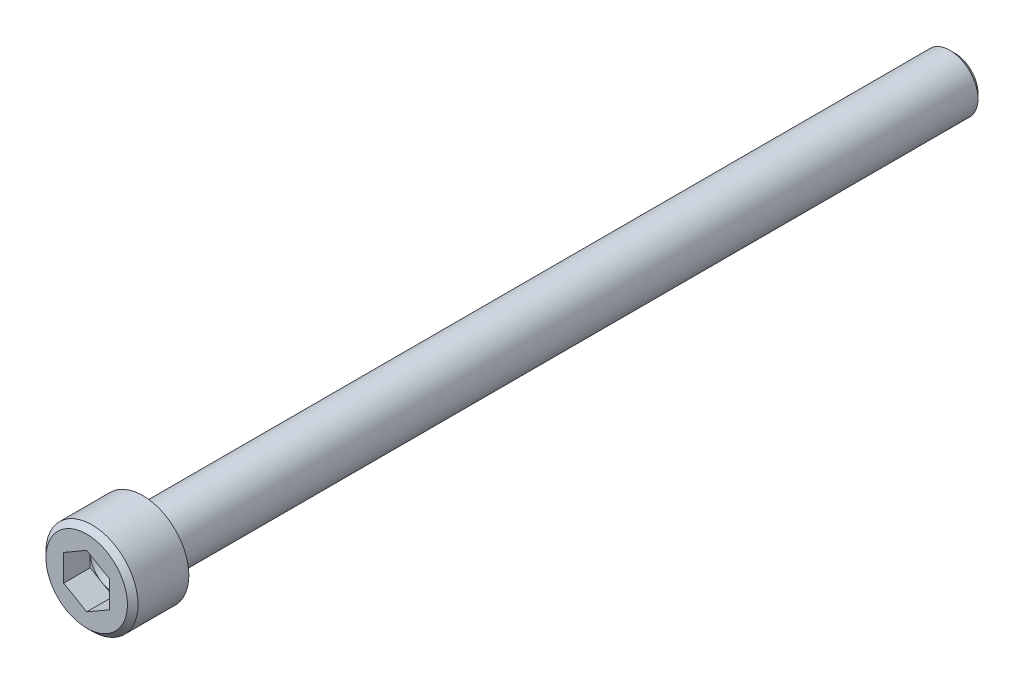
ISO-10303-21;
HEADER;
FILE_DESCRIPTION(('STEP AP214'),'2;1');
FILE_NAME('part.step','',(''),(''),'','','');
FILE_SCHEMA(('AUTOMOTIVE_DESIGN { 1 0 10303 214 1 1 1 1 }'));
ENDSEC;
DATA;
#1=APPLICATION_CONTEXT('core data for automotive mechanical design processes');
#2=APPLICATION_PROTOCOL_DEFINITION('international standard','automotive_design',2000,#1);
#3=PRODUCT_CONTEXT('',#1,'mechanical');
#4=PRODUCT('Part','Part','',(#3));
#5=PRODUCT_RELATED_PRODUCT_CATEGORY('part','',(#4));
#6=PRODUCT_DEFINITION_FORMATION('','',#4);
#7=PRODUCT_DEFINITION_CONTEXT('part definition',#1,'design');
#8=PRODUCT_DEFINITION('design','',#6,#7);
#9=PRODUCT_DEFINITION_SHAPE('','',#8);
#10=(LENGTH_UNIT() NAMED_UNIT(*) SI_UNIT(.MILLI.,.METRE.));
#11=(NAMED_UNIT(*) PLANE_ANGLE_UNIT() SI_UNIT($,.RADIAN.));
#12=(NAMED_UNIT(*) SI_UNIT($,.STERADIAN.) SOLID_ANGLE_UNIT());
#13=UNCERTAINTY_MEASURE_WITH_UNIT(LENGTH_MEASURE(1.E-05),#10,'distance_accuracy_value','');
#14=(GEOMETRIC_REPRESENTATION_CONTEXT(3) GLOBAL_UNCERTAINTY_ASSIGNED_CONTEXT((#13)) GLOBAL_UNIT_ASSIGNED_CONTEXT((#10,
#11,#12)) REPRESENTATION_CONTEXT('',''));
#15=CARTESIAN_POINT('',(0.,0.,0.));
#16=DIRECTION('',(0.,0.,1.));
#17=DIRECTION('',(1.,0.,0.));
#18=AXIS2_PLACEMENT_3D('',#15,#16,#17);
#19=CARTESIAN_POINT('',(0.,0.,2.54));
#20=DIRECTION('',(0.,0.,1.));
#21=DIRECTION('',(1.,0.,0.));
#22=AXIS2_PLACEMENT_3D('',#19,#20,#21);
#23=PLANE('',#22);
#24=DIRECTION('',(0.,1.,0.));
#25=VECTOR('',#24,1.);
#26=CARTESIAN_POINT('',(-1.9812,0.,2.54));
#27=LINE('',#26,#25);
#28=CARTESIAN_POINT('',(-1.9812,0.,2.54));
#29=VERTEX_POINT('',#28);
#30=CARTESIAN_POINT('',(-1.9812,1.14384635331848,2.54));
#31=VERTEX_POINT('',#30);
#32=EDGE_CURVE('E398',#29,#31,#27,.T.);
#33=ORIENTED_EDGE('',*,*,#32,.F.);
#34=CARTESIAN_POINT('',(0.,0.,2.54));
#35=DIRECTION('',(0.,0.,-1.));
#36=DIRECTION('',(-1.,0.,0.));
#37=AXIS2_PLACEMENT_3D('',#34,#35,#36);
#38=CIRCLE('',#37,1.9812);
#39=CARTESIAN_POINT('',(-0.9906,1.71576952997773,2.54));
#40=VERTEX_POINT('',#39);
#41=EDGE_CURVE('E33',#29,#40,#38,.T.);
#42=ORIENTED_EDGE('',*,*,#41,.T.);
#43=DIRECTION('',(0.866025403784439,0.5,0.));
#44=VECTOR('',#43,1.);
#45=CARTESIAN_POINT('',(0.163354175866616,2.38200528404682,2.54));
#46=LINE('',#45,#44);
#47=EDGE_CURVE('E393',#31,#40,#46,.T.);
#48=ORIENTED_EDGE('',*,*,#47,.F.);
#49=EDGE_LOOP('',(#33,#42,#48));
#50=FACE_BOUND('',#49,.T.);
#51=ADVANCED_FACE('F17',(#50),#23,.T.);
#52=CARTESIAN_POINT('',(0.,2.28769270663697,2.54));
#53=VERTEX_POINT('',#52);
#54=EDGE_CURVE('E391',#40,#53,#46,.T.);
#55=ORIENTED_EDGE('',*,*,#54,.F.);
#56=CARTESIAN_POINT('',(0.9906,1.71576952997773,2.54));
#57=VERTEX_POINT('',#56);
#58=EDGE_CURVE('E224',#40,#57,#38,.T.);
#59=ORIENTED_EDGE('',*,*,#58,.T.);
#60=DIRECTION('',(0.866025403784439,-0.5,0.));
#61=VECTOR('',#60,1.);
#62=CARTESIAN_POINT('',(-0.163354175866613,2.38200528404681,2.54));
#63=LINE('',#62,#61);
#64=EDGE_CURVE('E383',#53,#57,#63,.T.);
#65=ORIENTED_EDGE('',*,*,#64,.F.);
#66=EDGE_LOOP('',(#55,#59,#65));
#67=FACE_BOUND('',#66,.T.);
#68=ADVANCED_FACE('F105',(#67),#23,.T.);
#69=CARTESIAN_POINT('',(1.9812,1.14384635331849,2.54));
#70=VERTEX_POINT('',#69);
#71=EDGE_CURVE('E189',#57,#70,#63,.T.);
#72=ORIENTED_EDGE('',*,*,#71,.F.);
#73=CARTESIAN_POINT('',(1.9812,0.,2.54));
#74=VERTEX_POINT('',#73);
#75=EDGE_CURVE('E380',#57,#74,#38,.T.);
#76=ORIENTED_EDGE('',*,*,#75,.T.);
#77=DIRECTION('',(0.,-1.,0.));
#78=VECTOR('',#77,1.);
#79=CARTESIAN_POINT('',(1.9812,0.,2.54));
#80=LINE('',#79,#78);
#81=EDGE_CURVE('E160',#70,#74,#80,.T.);
#82=ORIENTED_EDGE('',*,*,#81,.F.);
#83=EDGE_LOOP('',(#72,#76,#82));
#84=FACE_BOUND('',#83,.T.);
#85=ADVANCED_FACE('F111',(#84),#23,.T.);
#86=CARTESIAN_POINT('',(1.9812,-1.14384635331849,2.54));
#87=VERTEX_POINT('',#86);
#88=EDGE_CURVE('E155',#74,#87,#80,.T.);
#89=ORIENTED_EDGE('',*,*,#88,.F.);
#90=CARTESIAN_POINT('',(0.9906,-1.71576952997773,2.54));
#91=VERTEX_POINT('',#90);
#92=EDGE_CURVE('E416',#74,#91,#38,.T.);
#93=ORIENTED_EDGE('',*,*,#92,.T.);
#94=DIRECTION('',(-0.866025403784438,-0.5,0.));
#95=VECTOR('',#94,1.);
#96=CARTESIAN_POINT('',(2.14455417586661,-1.04953377590865,2.54));
#97=LINE('',#96,#95);
#98=EDGE_CURVE('E148',#87,#91,#97,.T.);
#99=ORIENTED_EDGE('',*,*,#98,.F.);
#100=EDGE_LOOP('',(#89,#93,#99));
#101=FACE_BOUND('',#100,.T.);
#102=ADVANCED_FACE('F129',(#101),#23,.T.);
#103=CARTESIAN_POINT('',(0.,-2.28769270663697,2.54));
#104=VERTEX_POINT('',#103);
#105=EDGE_CURVE('E141',#91,#104,#97,.T.);
#106=ORIENTED_EDGE('',*,*,#105,.F.);
#107=CARTESIAN_POINT('',(-0.9906,-1.71576952997773,2.54));
#108=VERTEX_POINT('',#107);
#109=EDGE_CURVE('E143',#91,#108,#38,.T.);
#110=ORIENTED_EDGE('',*,*,#109,.T.);
#111=DIRECTION('',(-0.866025403784439,0.5,0.));
#112=VECTOR('',#111,1.);
#113=CARTESIAN_POINT('',(-2.14455417586661,-1.04953377590865,2.54));
#114=LINE('',#113,#112);
#115=EDGE_CURVE('E145',#104,#108,#114,.T.);
#116=ORIENTED_EDGE('',*,*,#115,.F.);
#117=EDGE_LOOP('',(#106,#110,#116));
#118=FACE_BOUND('',#117,.T.);
#119=ADVANCED_FACE('F119',(#118),#23,.T.);
#120=CARTESIAN_POINT('',(0.,0.,4.826));
#121=DIRECTION('',(0.,0.,1.));
#122=DIRECTION('',(1.,0.,0.));
#123=AXIS2_PLACEMENT_3D('',#120,#121,#122);
#124=PLANE('',#123);
#125=CARTESIAN_POINT('',(0.,0.,4.826));
#126=DIRECTION('',(0.,0.,1.));
#127=DIRECTION('',(1.,0.,0.));
#128=AXIS2_PLACEMENT_3D('',#125,#126,#127);
#129=CIRCLE('',#128,3.5052);
#130=CARTESIAN_POINT('',(3.5052,0.,4.826));
#131=VERTEX_POINT('',#130);
#132=EDGE_CURVE('E210',#131,#131,#129,.T.);
#133=ORIENTED_EDGE('',*,*,#132,.T.);
#134=EDGE_LOOP('',(#133));
#135=FACE_BOUND('',#134,.T.);
#136=DIRECTION('',(0.866025403784439,0.5,0.));
#137=VECTOR('',#136,1.);
#138=CARTESIAN_POINT('',(0.163354175866616,2.38200528404682,4.826));
#139=LINE('',#138,#137);
#140=CARTESIAN_POINT('',(-1.9812,1.14384635331848,4.826));
#141=VERTEX_POINT('',#140);
#142=CARTESIAN_POINT('',(0.,2.28769270663697,4.826));
#143=VERTEX_POINT('',#142);
#144=EDGE_CURVE('E171',#141,#143,#139,.T.);
#145=ORIENTED_EDGE('',*,*,#144,.T.);
#146=DIRECTION('',(0.866025403784439,-0.5,0.));
#147=VECTOR('',#146,1.);
#148=CARTESIAN_POINT('',(-0.163354175866613,2.38200528404681,4.826));
#149=LINE('',#148,#147);
#150=CARTESIAN_POINT('',(1.9812,1.14384635331849,4.826));
#151=VERTEX_POINT('',#150);
#152=EDGE_CURVE('E167',#143,#151,#149,.T.);
#153=ORIENTED_EDGE('',*,*,#152,.T.);
#154=DIRECTION('',(0.,-1.,0.));
#155=VECTOR('',#154,1.);
#156=CARTESIAN_POINT('',(1.9812,0.,4.826));
#157=LINE('',#156,#155);
#158=CARTESIAN_POINT('',(1.9812,-1.14384635331849,4.826));
#159=VERTEX_POINT('',#158);
#160=EDGE_CURVE('E185',#151,#159,#157,.T.);
#161=ORIENTED_EDGE('',*,*,#160,.T.);
#162=DIRECTION('',(-0.866025403784438,-0.5,0.));
#163=VECTOR('',#162,1.);
#164=CARTESIAN_POINT('',(2.14455417586661,-1.04953377590865,4.826));
#165=LINE('',#164,#163);
#166=CARTESIAN_POINT('',(0.,-2.28769270663697,4.826));
#167=VERTEX_POINT('',#166);
#168=EDGE_CURVE('E41',#159,#167,#165,.T.);
#169=ORIENTED_EDGE('',*,*,#168,.T.);
#170=DIRECTION('',(-0.866025403784439,0.5,0.));
#171=VECTOR('',#170,1.);
#172=CARTESIAN_POINT('',(-2.14455417586661,-1.04953377590865,4.826));
#173=LINE('',#172,#171);
#174=CARTESIAN_POINT('',(-1.9812,-1.14384635331849,4.826));
#175=VERTEX_POINT('',#174);
#176=EDGE_CURVE('E179',#167,#175,#173,.T.);
#177=ORIENTED_EDGE('',*,*,#176,.T.);
#178=DIRECTION('',(0.,1.,0.));
#179=VECTOR('',#178,1.);
#180=CARTESIAN_POINT('',(-1.9812,0.,4.826));
#181=LINE('',#180,#179);
#182=EDGE_CURVE('E175',#175,#141,#181,.T.);
#183=ORIENTED_EDGE('',*,*,#182,.T.);
#184=EDGE_LOOP('',(#145,#153,#161,#169,#177,#183));
#185=FACE_BOUND('',#184,.T.);
#186=ADVANCED_FACE('F128',(#135,#185),#124,.T.);
#187=CARTESIAN_POINT('',(0.,0.,4.826));
#188=DIRECTION('',(0.,0.,-1.));
#189=DIRECTION('',(-1.,0.,0.));
#190=AXIS2_PLACEMENT_3D('',#187,#188,#189);
#191=CYLINDRICAL_SURFACE('',#190,3.9624);
#192=CARTESIAN_POINT('',(0.,0.,4.3688));
#193=DIRECTION('',(0.,0.,1.));
#194=DIRECTION('',(1.,0.,0.));
#195=AXIS2_PLACEMENT_3D('',#192,#193,#194);
#196=CIRCLE('',#195,3.9624);
#197=CARTESIAN_POINT('',(3.9624,0.,4.3688));
#198=VERTEX_POINT('',#197);
#199=EDGE_CURVE('E214',#198,#198,#196,.F.);
#200=ORIENTED_EDGE('',*,*,#199,.T.);
#201=EDGE_LOOP('',(#200));
#202=FACE_BOUND('',#201,.T.);
#203=CARTESIAN_POINT('',(0.,0.,0.));
#204=DIRECTION('',(0.,0.,1.));
#205=DIRECTION('',(1.,0.,0.));
#206=AXIS2_PLACEMENT_3D('',#203,#204,#205);
#207=CIRCLE('',#206,3.9624);
#208=CARTESIAN_POINT('',(3.9624,0.,0.));
#209=VERTEX_POINT('',#208);
#210=EDGE_CURVE('E206',#209,#209,#207,.T.);
#211=ORIENTED_EDGE('',*,*,#210,.T.);
#212=EDGE_LOOP('',(#211));
#213=FACE_BOUND('',#212,.T.);
#214=ADVANCED_FACE('F134',(#202,#213),#191,.T.);
#215=CARTESIAN_POINT('',(0.,0.,0.));
#216=DIRECTION('',(0.,0.,1.));
#217=DIRECTION('',(1.,0.,0.));
#218=AXIS2_PLACEMENT_3D('',#215,#216,#217);
#219=PLANE('',#218);
#220=CARTESIAN_POINT('',(0.,0.,0.));
#221=DIRECTION('',(0.,0.,1.));
#222=DIRECTION('',(1.,0.,0.));
#223=AXIS2_PLACEMENT_3D('',#220,#221,#222);
#224=CIRCLE('',#223,2.5654);
#225=CARTESIAN_POINT('',(2.5654,0.,0.));
#226=VERTEX_POINT('',#225);
#227=EDGE_CURVE('E223',#226,#226,#224,.T.);
#228=ORIENTED_EDGE('',*,*,#227,.T.);
#229=EDGE_LOOP('',(#228));
#230=FACE_BOUND('',#229,.T.);
#231=ORIENTED_EDGE('',*,*,#210,.F.);
#232=EDGE_LOOP('',(#231));
#233=FACE_BOUND('',#232,.T.);
#234=ADVANCED_FACE('F324',(#230,#233),#219,.F.);
#235=CARTESIAN_POINT('',(0.,0.,4.826));
#236=DIRECTION('',(0.,0.,-1.));
#237=DIRECTION('',(-1.,0.,0.));
#238=AXIS2_PLACEMENT_3D('',#235,#236,#237);
#239=CONICAL_SURFACE('',#238,3.5052,0.785398163397449);
#240=ORIENTED_EDGE('',*,*,#199,.F.);
#241=EDGE_LOOP('',(#240));
#242=FACE_BOUND('',#241,.T.);
#243=ORIENTED_EDGE('',*,*,#132,.F.);
#244=EDGE_LOOP('',(#243));
#245=FACE_BOUND('',#244,.T.);
#246=ADVANCED_FACE('F315',(#242,#245),#239,.T.);
#247=CARTESIAN_POINT('',(-0.163354175866613,2.38200528404681,2.54));
#248=DIRECTION('',(-0.5,-0.866025403784439,0.));
#249=DIRECTION('',(0.866025403784439,-0.5,0.));
#250=AXIS2_PLACEMENT_3D('',#247,#248,#249);
#251=PLANE('',#250);
#252=ORIENTED_EDGE('',*,*,#152,.F.);
#253=DIRECTION('',(0.,0.,1.));
#254=VECTOR('',#253,1.);
#255=CARTESIAN_POINT('',(0.,2.28769270663697,2.54));
#256=LINE('',#255,#254);
#257=EDGE_CURVE('E203',#53,#143,#256,.T.);
#258=ORIENTED_EDGE('',*,*,#257,.F.);
#259=ORIENTED_EDGE('',*,*,#64,.T.);
#260=ORIENTED_EDGE('',*,*,#71,.T.);
#261=DIRECTION('',(0.,0.,1.));
#262=VECTOR('',#261,1.);
#263=CARTESIAN_POINT('',(1.9812,1.14384635331849,2.54));
#264=LINE('',#263,#262);
#265=EDGE_CURVE('E166',#70,#151,#264,.T.);
#266=ORIENTED_EDGE('',*,*,#265,.T.);
#267=EDGE_LOOP('',(#252,#258,#259,#260,#266));
#268=FACE_BOUND('',#267,.T.);
#269=ADVANCED_FACE('F306',(#268),#251,.T.);
#270=CARTESIAN_POINT('',(0.163354175866616,2.38200528404682,2.54));
#271=DIRECTION('',(0.5,-0.866025403784438,0.));
#272=DIRECTION('',(0.866025403784438,0.5,0.));
#273=AXIS2_PLACEMENT_3D('',#270,#271,#272);
#274=PLANE('',#273);
#275=ORIENTED_EDGE('',*,*,#144,.F.);
#276=DIRECTION('',(0.,0.,1.));
#277=VECTOR('',#276,1.);
#278=CARTESIAN_POINT('',(-1.9812,1.14384635331848,2.54));
#279=LINE('',#278,#277);
#280=EDGE_CURVE('E200',#31,#141,#279,.T.);
#281=ORIENTED_EDGE('',*,*,#280,.F.);
#282=ORIENTED_EDGE('',*,*,#47,.T.);
#283=ORIENTED_EDGE('',*,*,#54,.T.);
#284=ORIENTED_EDGE('',*,*,#257,.T.);
#285=EDGE_LOOP('',(#275,#281,#282,#283,#284));
#286=FACE_BOUND('',#285,.T.);
#287=ADVANCED_FACE('F297',(#286),#274,.T.);
#288=CARTESIAN_POINT('',(-1.9812,0.,2.54));
#289=DIRECTION('',(1.,0.,0.));
#290=DIRECTION('',(0.,1.,0.));
#291=AXIS2_PLACEMENT_3D('',#288,#289,#290);
#292=PLANE('',#291);
#293=ORIENTED_EDGE('',*,*,#182,.F.);
#294=DIRECTION('',(0.,0.,1.));
#295=VECTOR('',#294,1.);
#296=CARTESIAN_POINT('',(-1.9812,-1.14384635331849,2.54));
#297=LINE('',#296,#295);
#298=CARTESIAN_POINT('',(-1.9812,-1.14384635331849,2.54));
#299=VERTEX_POINT('',#298);
#300=EDGE_CURVE('E197',#299,#175,#297,.T.);
#301=ORIENTED_EDGE('',*,*,#300,.F.);
#302=EDGE_CURVE('E399',#299,#29,#27,.T.);
#303=ORIENTED_EDGE('',*,*,#302,.T.);
#304=ORIENTED_EDGE('',*,*,#32,.T.);
#305=ORIENTED_EDGE('',*,*,#280,.T.);
#306=EDGE_LOOP('',(#293,#301,#303,#304,#305));
#307=FACE_BOUND('',#306,.T.);
#308=ADVANCED_FACE('F288',(#307),#292,.T.);
#309=CARTESIAN_POINT('',(-2.14455417586661,-1.04953377590865,2.54));
#310=DIRECTION('',(0.5,0.866025403784439,0.));
#311=DIRECTION('',(-0.866025403784439,0.5,0.));
#312=AXIS2_PLACEMENT_3D('',#309,#310,#311);
#313=PLANE('',#312);
#314=ORIENTED_EDGE('',*,*,#176,.F.);
#315=DIRECTION('',(0.,0.,1.));
#316=VECTOR('',#315,1.);
#317=CARTESIAN_POINT('',(0.,-2.28769270663697,2.54));
#318=LINE('',#317,#316);
#319=EDGE_CURVE('E194',#104,#167,#318,.T.);
#320=ORIENTED_EDGE('',*,*,#319,.F.);
#321=ORIENTED_EDGE('',*,*,#115,.T.);
#322=EDGE_CURVE('E402',#108,#299,#114,.T.);
#323=ORIENTED_EDGE('',*,*,#322,.T.);
#324=ORIENTED_EDGE('',*,*,#300,.T.);
#325=EDGE_LOOP('',(#314,#320,#321,#323,#324));
#326=FACE_BOUND('',#325,.T.);
#327=ADVANCED_FACE('F280',(#326),#313,.T.);
#328=CARTESIAN_POINT('',(2.14455417586661,-1.04953377590865,2.54));
#329=DIRECTION('',(-0.5,0.866025403784438,0.));
#330=DIRECTION('',(-0.866025403784438,-0.5,0.));
#331=AXIS2_PLACEMENT_3D('',#328,#329,#330);
#332=PLANE('',#331);
#333=ORIENTED_EDGE('',*,*,#168,.F.);
#334=DIRECTION('',(0.,0.,1.));
#335=VECTOR('',#334,1.);
#336=CARTESIAN_POINT('',(1.9812,-1.14384635331849,2.54));
#337=LINE('',#336,#335);
#338=EDGE_CURVE('E151',#87,#159,#337,.T.);
#339=ORIENTED_EDGE('',*,*,#338,.F.);
#340=ORIENTED_EDGE('',*,*,#98,.T.);
#341=ORIENTED_EDGE('',*,*,#105,.T.);
#342=ORIENTED_EDGE('',*,*,#319,.T.);
#343=EDGE_LOOP('',(#333,#339,#340,#341,#342));
#344=FACE_BOUND('',#343,.T.);
#345=ADVANCED_FACE('F124',(#344),#332,.T.);
#346=CARTESIAN_POINT('',(1.9812,0.,2.54));
#347=DIRECTION('',(-1.,0.,0.));
#348=DIRECTION('',(0.,-1.,0.));
#349=AXIS2_PLACEMENT_3D('',#346,#347,#348);
#350=PLANE('',#349);
#351=ORIENTED_EDGE('',*,*,#160,.F.);
#352=ORIENTED_EDGE('',*,*,#265,.F.);
#353=ORIENTED_EDGE('',*,*,#81,.T.);
#354=ORIENTED_EDGE('',*,*,#88,.T.);
#355=ORIENTED_EDGE('',*,*,#338,.T.);
#356=EDGE_LOOP('',(#351,#352,#353,#354,#355));
#357=FACE_BOUND('',#356,.T.);
#358=ADVANCED_FACE('F117',(#357),#350,.T.);
#359=ORIENTED_EDGE('',*,*,#322,.F.);
#360=EDGE_CURVE('E218',#108,#29,#38,.T.);
#361=ORIENTED_EDGE('',*,*,#360,.T.);
#362=ORIENTED_EDGE('',*,*,#302,.F.);
#363=EDGE_LOOP('',(#359,#361,#362));
#364=FACE_BOUND('',#363,.T.);
#365=ADVANCED_FACE('F108',(#364),#23,.T.);
#366=CARTESIAN_POINT('',(0.,0.,-69.85));
#367=DIRECTION('',(0.,0.,1.));
#368=DIRECTION('',(1.,0.,0.));
#369=AXIS2_PLACEMENT_3D('',#366,#367,#368);
#370=CYLINDRICAL_SURFACE('',#369,2.413);
#371=CARTESIAN_POINT('',(0.,0.,-69.42105761938));
#372=DIRECTION('',(0.,0.,-1.));
#373=DIRECTION('',(-1.,0.,0.));
#374=AXIS2_PLACEMENT_3D('',#371,#372,#373);
#375=CIRCLE('',#374,2.413);
#376=CARTESIAN_POINT('',(-2.413,0.,-69.42105761938));
#377=VERTEX_POINT('',#376);
#378=EDGE_CURVE('E11',#377,#377,#375,.F.);
#379=ORIENTED_EDGE('',*,*,#378,.T.);
#380=EDGE_LOOP('',(#379));
#381=FACE_BOUND('',#380,.T.);
#382=CARTESIAN_POINT('',(0.,0.,-0.152399999999997));
#383=DIRECTION('',(0.,0.,1.));
#384=DIRECTION('',(1.,0.,0.));
#385=AXIS2_PLACEMENT_3D('',#382,#383,#384);
#386=CIRCLE('',#385,2.413);
#387=CARTESIAN_POINT('',(2.413,0.,-0.152399999999997));
#388=VERTEX_POINT('',#387);
#389=EDGE_CURVE('E219',#388,#388,#386,.F.);
#390=ORIENTED_EDGE('',*,*,#389,.T.);
#391=EDGE_LOOP('',(#390));
#392=FACE_BOUND('',#391,.T.);
#393=ADVANCED_FACE('F101',(#381,#392),#370,.T.);
#394=CARTESIAN_POINT('',(0.,0.,-69.85));
#395=DIRECTION('',(0.,0.,-1.));
#396=DIRECTION('',(1.,0.,0.));
#397=AXIS2_PLACEMENT_3D('',#394,#395,#396);
#398=PLANE('',#397);
#399=CARTESIAN_POINT('',(0.,0.,-69.85));
#400=DIRECTION('',(0.,0.,-1.));
#401=DIRECTION('',(-1.,0.,0.));
#402=AXIS2_PLACEMENT_3D('',#399,#400,#401);
#403=CIRCLE('',#402,1.98405761938);
#404=CARTESIAN_POINT('',(-1.98405761938,0.,-69.85));
#405=VERTEX_POINT('',#404);
#406=EDGE_CURVE('E26',#405,#405,#403,.T.);
#407=ORIENTED_EDGE('',*,*,#406,.T.);
#408=EDGE_LOOP('',(#407));
#409=FACE_BOUND('',#408,.T.);
#410=ADVANCED_FACE('F94',(#409),#398,.T.);
#411=CARTESIAN_POINT('',(0.,0.,1.39615364668151));
#412=DIRECTION('',(0.,0.,1.));
#413=DIRECTION('',(1.,0.,0.));
#414=AXIS2_PLACEMENT_3D('',#411,#412,#413);
#415=CONICAL_SURFACE('',#414,0.,1.0471975511966);
#416=ORIENTED_EDGE('',*,*,#41,.F.);
#417=ORIENTED_EDGE('',*,*,#360,.F.);
#418=ORIENTED_EDGE('',*,*,#109,.F.);
#419=ORIENTED_EDGE('',*,*,#92,.F.);
#420=ORIENTED_EDGE('',*,*,#75,.F.);
#421=ORIENTED_EDGE('',*,*,#58,.F.);
#422=EDGE_LOOP('',(#416,#417,#418,#419,#420,#421));
#423=FACE_BOUND('',#422,.T.);
#424=CARTESIAN_POINT('',(0.,0.,1.39615364668151));
#425=VERTEX_POINT('',#424);
#426=VERTEX_LOOP('',#425);
#427=FACE_BOUND('',#426,.T.);
#428=ADVANCED_FACE('F91',(#423,#427),#415,.F.);
#429=CARTESIAN_POINT('',(0.,0.,-0.152399999999997));
#430=DIRECTION('',(0.,0.,1.));
#431=DIRECTION('',(1.,0.,0.));
#432=AXIS2_PLACEMENT_3D('',#429,#430,#431);
#433=TOROIDAL_SURFACE('',#432,2.5654,0.1524);
#434=ORIENTED_EDGE('',*,*,#227,.F.);
#435=EDGE_LOOP('',(#434));
#436=FACE_BOUND('',#435,.T.);
#437=ORIENTED_EDGE('',*,*,#389,.F.);
#438=EDGE_LOOP('',(#437));
#439=FACE_BOUND('',#438,.T.);
#440=ADVANCED_FACE('F93',(#436,#439),#433,.F.);
#441=CARTESIAN_POINT('',(0.,0.,-69.85));
#442=DIRECTION('',(0.,0.,1.));
#443=DIRECTION('',(1.,0.,0.));
#444=AXIS2_PLACEMENT_3D('',#441,#442,#443);
#445=CONICAL_SURFACE('',#444,1.98405761938,0.785398163397453);
#446=ORIENTED_EDGE('',*,*,#378,.F.);
#447=EDGE_LOOP('',(#446));
#448=FACE_BOUND('',#447,.T.);
#449=ORIENTED_EDGE('',*,*,#406,.F.);
#450=EDGE_LOOP('',(#449));
#451=FACE_BOUND('',#450,.T.);
#452=ADVANCED_FACE('F19',(#448,#451),#445,.T.);
#453=CLOSED_SHELL('',(#51,#68,#85,#102,#119,#186,#214,#234,#246,#269,#287,#308,#327,#345,#358,
#365,#393,#410,#428,#440,#452));
#454=MANIFOLD_SOLID_BREP('B1',#453);
#455=ADVANCED_BREP_SHAPE_REPRESENTATION('',(#18,#454),#14);
#456=SHAPE_DEFINITION_REPRESENTATION(#9,#455);
ENDSEC;
END-ISO-10303-21;
